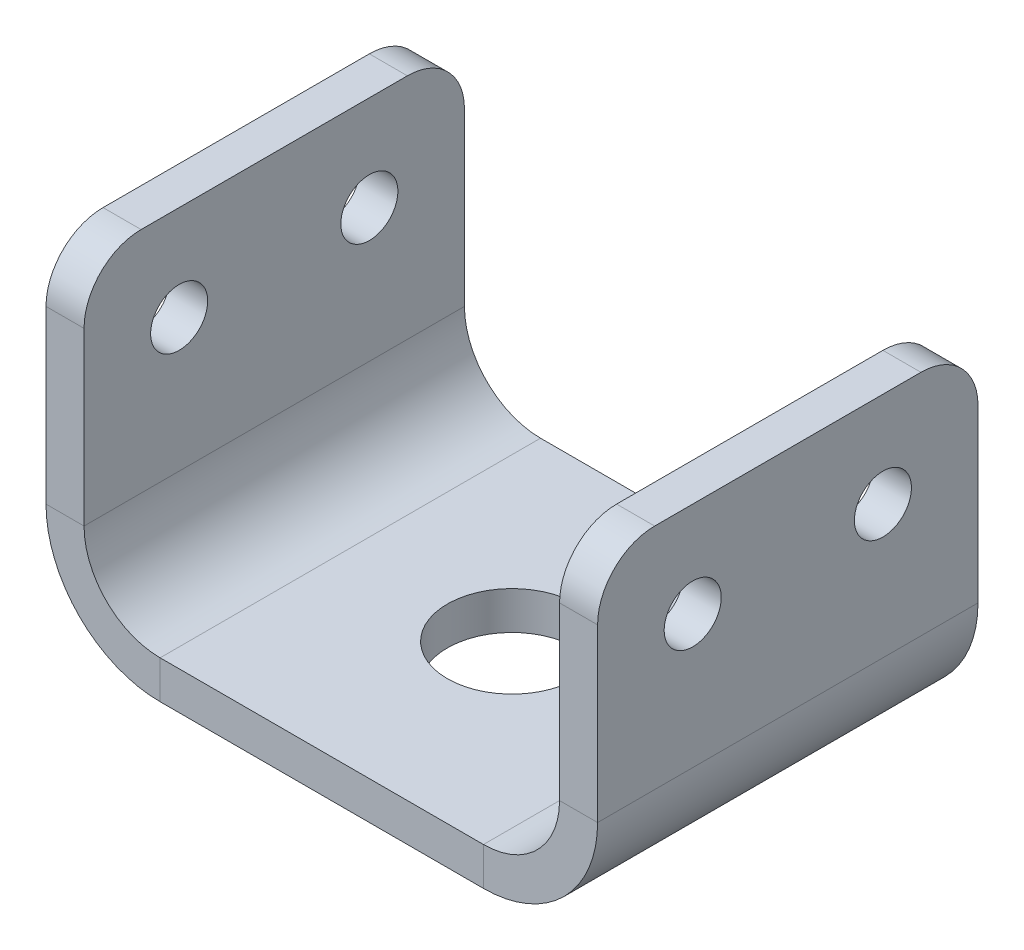
ISO-10303-21;
HEADER;
FILE_DESCRIPTION(('STEP AP214'),'2;1');
FILE_NAME('part.step','',(''),(''),'','','');
FILE_SCHEMA(('AUTOMOTIVE_DESIGN { 1 0 10303 214 1 1 1 1 }'));
ENDSEC;
DATA;
#1=APPLICATION_CONTEXT('core data for automotive mechanical design processes');
#2=APPLICATION_PROTOCOL_DEFINITION('international standard','automotive_design',2000,#1);
#3=PRODUCT_CONTEXT('',#1,'mechanical');
#4=PRODUCT('Part','Part','',(#3));
#5=PRODUCT_RELATED_PRODUCT_CATEGORY('part','',(#4));
#6=PRODUCT_DEFINITION_FORMATION('','',#4);
#7=PRODUCT_DEFINITION_CONTEXT('part definition',#1,'design');
#8=PRODUCT_DEFINITION('design','',#6,#7);
#9=PRODUCT_DEFINITION_SHAPE('','',#8);
#10=(LENGTH_UNIT() NAMED_UNIT(*) SI_UNIT(.MILLI.,.METRE.));
#11=(NAMED_UNIT(*) PLANE_ANGLE_UNIT() SI_UNIT($,.RADIAN.));
#12=(NAMED_UNIT(*) SI_UNIT($,.STERADIAN.) SOLID_ANGLE_UNIT());
#13=UNCERTAINTY_MEASURE_WITH_UNIT(LENGTH_MEASURE(1.E-05),#10,'distance_accuracy_value','');
#14=(GEOMETRIC_REPRESENTATION_CONTEXT(3) GLOBAL_UNCERTAINTY_ASSIGNED_CONTEXT((#13)) GLOBAL_UNIT_ASSIGNED_CONTEXT((#10,
#11,#12)) REPRESENTATION_CONTEXT('',''));
#15=CARTESIAN_POINT('',(0.,0.,0.));
#16=DIRECTION('',(0.,0.,1.));
#17=DIRECTION('',(1.,0.,0.));
#18=AXIS2_PLACEMENT_3D('',#15,#16,#17);
#19=CARTESIAN_POINT('',(14.5,-6.,10.));
#20=DIRECTION('',(0.,0.,-1.));
#21=DIRECTION('',(-1.,0.,0.));
#22=AXIS2_PLACEMENT_3D('',#19,#20,#21);
#23=PLANE('',#22);
#24=DIRECTION('',(0.,-1.,0.));
#25=VECTOR('',#24,1.);
#26=CARTESIAN_POINT('',(8.5,-6.,10.));
#27=LINE('',#26,#25);
#28=CARTESIAN_POINT('',(8.5,-4.,10.));
#29=VERTEX_POINT('',#28);
#30=CARTESIAN_POINT('',(8.5,-6.,10.));
#31=VERTEX_POINT('',#30);
#32=EDGE_CURVE('E11',#29,#31,#27,.T.);
#33=ORIENTED_EDGE('',*,*,#32,.F.);
#34=DIRECTION('',(1.,0.,0.));
#35=VECTOR('',#34,1.);
#36=CARTESIAN_POINT('',(14.5,-4.,10.));
#37=LINE('',#36,#35);
#38=CARTESIAN_POINT('',(-8.49999999999999,-4.,10.));
#39=VERTEX_POINT('',#38);
#40=EDGE_CURVE('E119',#29,#39,#37,.F.);
#41=ORIENTED_EDGE('',*,*,#40,.T.);
#42=DIRECTION('',(0.,-1.,0.));
#43=VECTOR('',#42,1.);
#44=CARTESIAN_POINT('',(-8.49999999999999,-6.,10.));
#45=LINE('',#44,#43);
#46=CARTESIAN_POINT('',(-8.49999999999999,-6.,10.));
#47=VERTEX_POINT('',#46);
#48=EDGE_CURVE('E55',#39,#47,#45,.T.);
#49=ORIENTED_EDGE('',*,*,#48,.T.);
#50=DIRECTION('',(-1.,0.,0.));
#51=VECTOR('',#50,1.);
#52=CARTESIAN_POINT('',(14.5,-6.,10.));
#53=LINE('',#52,#51);
#54=EDGE_CURVE('E122',#31,#47,#53,.T.);
#55=ORIENTED_EDGE('',*,*,#54,.F.);
#56=EDGE_LOOP('',(#33,#41,#49,#55));
#57=FACE_BOUND('',#56,.T.);
#58=ADVANCED_FACE('F45',(#57),#23,.F.);
#59=CARTESIAN_POINT('',(-8.5,0.,10.));
#60=DIRECTION('',(0.,0.,1.));
#61=DIRECTION('',(1.,0.,0.));
#62=AXIS2_PLACEMENT_3D('',#59,#60,#61);
#63=PLANE('',#62);
#64=ORIENTED_EDGE('',*,*,#48,.F.);
#65=CARTESIAN_POINT('',(-8.5,0.,10.));
#66=DIRECTION('',(0.,0.,1.));
#67=DIRECTION('',(0.,-1.,0.));
#68=AXIS2_PLACEMENT_3D('',#65,#66,#67);
#69=CIRCLE('',#68,4.);
#70=CARTESIAN_POINT('',(-12.5,0.,10.));
#71=VERTEX_POINT('',#70);
#72=EDGE_CURVE('E160',#39,#71,#69,.F.);
#73=ORIENTED_EDGE('',*,*,#72,.T.);
#74=DIRECTION('',(-1.,0.,0.));
#75=VECTOR('',#74,1.);
#76=CARTESIAN_POINT('',(-14.5,0.,10.));
#77=LINE('',#76,#75);
#78=CARTESIAN_POINT('',(-14.5,0.,10.));
#79=VERTEX_POINT('',#78);
#80=EDGE_CURVE('E63',#71,#79,#77,.T.);
#81=ORIENTED_EDGE('',*,*,#80,.T.);
#82=CARTESIAN_POINT('',(-8.5,0.,10.));
#83=DIRECTION('',(0.,0.,-1.));
#84=DIRECTION('',(-1.,0.,0.));
#85=AXIS2_PLACEMENT_3D('',#82,#83,#84);
#86=CIRCLE('',#85,6.);
#87=EDGE_CURVE('E218',#47,#79,#86,.T.);
#88=ORIENTED_EDGE('',*,*,#87,.F.);
#89=EDGE_LOOP('',(#64,#73,#81,#88));
#90=FACE_BOUND('',#89,.T.);
#91=ADVANCED_FACE('F219',(#90),#63,.T.);
#92=CARTESIAN_POINT('',(-14.5,0.,10.));
#93=DIRECTION('',(0.,0.,-1.));
#94=DIRECTION('',(0.,-1.,0.));
#95=AXIS2_PLACEMENT_3D('',#92,#93,#94);
#96=PLANE('',#95);
#97=ORIENTED_EDGE('',*,*,#80,.F.);
#98=DIRECTION('',(0.,1.,0.));
#99=VECTOR('',#98,1.);
#100=CARTESIAN_POINT('',(-12.5,0.,10.));
#101=LINE('',#100,#99);
#102=CARTESIAN_POINT('',(-12.5,9.,10.));
#103=VERTEX_POINT('',#102);
#104=EDGE_CURVE('E274',#103,#71,#101,.F.);
#105=ORIENTED_EDGE('',*,*,#104,.F.);
#106=DIRECTION('',(-1.,0.,0.));
#107=VECTOR('',#106,1.);
#108=CARTESIAN_POINT('',(-14.5,9.,10.));
#109=LINE('',#108,#107);
#110=CARTESIAN_POINT('',(-14.5,9.,10.));
#111=VERTEX_POINT('',#110);
#112=EDGE_CURVE('E202',#103,#111,#109,.T.);
#113=ORIENTED_EDGE('',*,*,#112,.T.);
#114=DIRECTION('',(0.,-1.,0.));
#115=VECTOR('',#114,1.);
#116=CARTESIAN_POINT('',(-14.5,0.,10.));
#117=LINE('',#116,#115);
#118=EDGE_CURVE('E296',#111,#79,#117,.T.);
#119=ORIENTED_EDGE('',*,*,#118,.T.);
#120=EDGE_LOOP('',(#97,#105,#113,#119));
#121=FACE_BOUND('',#120,.T.);
#122=ADVANCED_FACE('F293',(#121),#96,.F.);
#123=CARTESIAN_POINT('',(-14.5,9.,7.));
#124=DIRECTION('',(-1.,0.,0.));
#125=DIRECTION('',(0.,0.,1.));
#126=AXIS2_PLACEMENT_3D('',#123,#124,#125);
#127=CYLINDRICAL_SURFACE('',#126,3.);
#128=ORIENTED_EDGE('',*,*,#112,.F.);
#129=CARTESIAN_POINT('',(-12.5,9.,7.));
#130=DIRECTION('',(-1.,0.,0.));
#131=DIRECTION('',(0.,0.,1.));
#132=AXIS2_PLACEMENT_3D('',#129,#130,#131);
#133=CIRCLE('',#132,3.);
#134=CARTESIAN_POINT('',(-12.5,12.,7.));
#135=VERTEX_POINT('',#134);
#136=EDGE_CURVE('E251',#103,#135,#133,.T.);
#137=ORIENTED_EDGE('',*,*,#136,.T.);
#138=DIRECTION('',(-1.,0.,0.));
#139=VECTOR('',#138,1.);
#140=CARTESIAN_POINT('',(-14.5,12.,7.));
#141=LINE('',#140,#139);
#142=CARTESIAN_POINT('',(-14.5,12.,7.));
#143=VERTEX_POINT('',#142);
#144=EDGE_CURVE('E199',#135,#143,#141,.T.);
#145=ORIENTED_EDGE('',*,*,#144,.T.);
#146=CARTESIAN_POINT('',(-14.5,9.,7.));
#147=DIRECTION('',(-1.,0.,0.));
#148=DIRECTION('',(0.,0.,1.));
#149=AXIS2_PLACEMENT_3D('',#146,#147,#148);
#150=CIRCLE('',#149,3.);
#151=EDGE_CURVE('E300',#111,#143,#150,.T.);
#152=ORIENTED_EDGE('',*,*,#151,.F.);
#153=EDGE_LOOP('',(#128,#137,#145,#152));
#154=FACE_BOUND('',#153,.T.);
#155=ADVANCED_FACE('F397',(#154),#127,.T.);
#156=CARTESIAN_POINT('',(-14.5,12.,-10.));
#157=DIRECTION('',(0.,-1.,0.));
#158=DIRECTION('',(0.,0.,1.));
#159=AXIS2_PLACEMENT_3D('',#156,#157,#158);
#160=PLANE('',#159);
#161=ORIENTED_EDGE('',*,*,#144,.F.);
#162=DIRECTION('',(0.,0.,1.));
#163=VECTOR('',#162,1.);
#164=CARTESIAN_POINT('',(-12.5,12.,0.));
#165=LINE('',#164,#163);
#166=CARTESIAN_POINT('',(-12.5,12.,-7.));
#167=VERTEX_POINT('',#166);
#168=EDGE_CURVE('E169',#167,#135,#165,.T.);
#169=ORIENTED_EDGE('',*,*,#168,.F.);
#170=DIRECTION('',(-1.,0.,0.));
#171=VECTOR('',#170,1.);
#172=CARTESIAN_POINT('',(-14.5,12.,-7.));
#173=LINE('',#172,#171);
#174=CARTESIAN_POINT('',(-14.5,12.,-7.));
#175=VERTEX_POINT('',#174);
#176=EDGE_CURVE('E196',#167,#175,#173,.T.);
#177=ORIENTED_EDGE('',*,*,#176,.T.);
#178=DIRECTION('',(0.,0.,1.));
#179=VECTOR('',#178,1.);
#180=CARTESIAN_POINT('',(-14.5,12.,-10.));
#181=LINE('',#180,#179);
#182=EDGE_CURVE('E330',#175,#143,#181,.T.);
#183=ORIENTED_EDGE('',*,*,#182,.T.);
#184=EDGE_LOOP('',(#161,#169,#177,#183));
#185=FACE_BOUND('',#184,.T.);
#186=ADVANCED_FACE('F391',(#185),#160,.F.);
#187=CARTESIAN_POINT('',(-14.5,9.,-7.));
#188=DIRECTION('',(-1.,0.,0.));
#189=DIRECTION('',(0.,0.,1.));
#190=AXIS2_PLACEMENT_3D('',#187,#188,#189);
#191=CYLINDRICAL_SURFACE('',#190,3.);
#192=ORIENTED_EDGE('',*,*,#176,.F.);
#193=CARTESIAN_POINT('',(-12.5,9.,-7.));
#194=DIRECTION('',(-1.,0.,0.));
#195=DIRECTION('',(0.,0.,1.));
#196=AXIS2_PLACEMENT_3D('',#193,#194,#195);
#197=CIRCLE('',#196,3.);
#198=CARTESIAN_POINT('',(-12.5,9.,-9.99999999999999));
#199=VERTEX_POINT('',#198);
#200=EDGE_CURVE('E275',#167,#199,#197,.T.);
#201=ORIENTED_EDGE('',*,*,#200,.T.);
#202=DIRECTION('',(-1.,0.,0.));
#203=VECTOR('',#202,1.);
#204=CARTESIAN_POINT('',(-14.5,9.,-9.99999999999999));
#205=LINE('',#204,#203);
#206=CARTESIAN_POINT('',(-14.5,9.,-9.99999999999999));
#207=VERTEX_POINT('',#206);
#208=EDGE_CURVE('E193',#199,#207,#205,.T.);
#209=ORIENTED_EDGE('',*,*,#208,.T.);
#210=CARTESIAN_POINT('',(-14.5,9.,-7.));
#211=DIRECTION('',(-1.,0.,0.));
#212=DIRECTION('',(0.,0.,1.));
#213=AXIS2_PLACEMENT_3D('',#210,#211,#212);
#214=CIRCLE('',#213,3.);
#215=EDGE_CURVE('E310',#175,#207,#214,.T.);
#216=ORIENTED_EDGE('',*,*,#215,.F.);
#217=EDGE_LOOP('',(#192,#201,#209,#216));
#218=FACE_BOUND('',#217,.T.);
#219=ADVANCED_FACE('F394',(#218),#191,.T.);
#220=CARTESIAN_POINT('',(-14.5,0.,-10.));
#221=DIRECTION('',(0.,0.,1.));
#222=DIRECTION('',(0.,1.,0.));
#223=AXIS2_PLACEMENT_3D('',#220,#221,#222);
#224=PLANE('',#223);
#225=ORIENTED_EDGE('',*,*,#208,.F.);
#226=DIRECTION('',(0.,1.,0.));
#227=VECTOR('',#226,1.);
#228=CARTESIAN_POINT('',(-12.5,0.,-10.));
#229=LINE('',#228,#227);
#230=CARTESIAN_POINT('',(-12.5,0.,-10.));
#231=VERTEX_POINT('',#230);
#232=EDGE_CURVE('E271',#231,#199,#229,.T.);
#233=ORIENTED_EDGE('',*,*,#232,.F.);
#234=DIRECTION('',(-1.,0.,0.));
#235=VECTOR('',#234,1.);
#236=CARTESIAN_POINT('',(-14.5,0.,-10.));
#237=LINE('',#236,#235);
#238=CARTESIAN_POINT('',(-14.5,0.,-10.));
#239=VERTEX_POINT('',#238);
#240=EDGE_CURVE('E191',#231,#239,#237,.T.);
#241=ORIENTED_EDGE('',*,*,#240,.T.);
#242=DIRECTION('',(0.,1.,0.));
#243=VECTOR('',#242,1.);
#244=CARTESIAN_POINT('',(-14.5,0.,-10.));
#245=LINE('',#244,#243);
#246=EDGE_CURVE('E301',#239,#207,#245,.T.);
#247=ORIENTED_EDGE('',*,*,#246,.T.);
#248=EDGE_LOOP('',(#225,#233,#241,#247));
#249=FACE_BOUND('',#248,.T.);
#250=ADVANCED_FACE('F395',(#249),#224,.F.);
#251=CARTESIAN_POINT('',(-8.5,0.,-10.));
#252=DIRECTION('',(0.,0.,1.));
#253=DIRECTION('',(0.,-1.,0.));
#254=AXIS2_PLACEMENT_3D('',#251,#252,#253);
#255=PLANE('',#254);
#256=ORIENTED_EDGE('',*,*,#240,.F.);
#257=CARTESIAN_POINT('',(-8.5,0.,-10.));
#258=DIRECTION('',(0.,0.,1.));
#259=DIRECTION('',(0.,-1.,0.));
#260=AXIS2_PLACEMENT_3D('',#257,#258,#259);
#261=CIRCLE('',#260,4.);
#262=CARTESIAN_POINT('',(-8.49999999999999,-4.,-10.));
#263=VERTEX_POINT('',#262);
#264=EDGE_CURVE('E268',#231,#263,#261,.T.);
#265=ORIENTED_EDGE('',*,*,#264,.T.);
#266=DIRECTION('',(0.,-1.,0.));
#267=VECTOR('',#266,1.);
#268=CARTESIAN_POINT('',(-8.49999999999999,-6.,-10.));
#269=LINE('',#268,#267);
#270=CARTESIAN_POINT('',(-8.49999999999999,-6.,-10.));
#271=VERTEX_POINT('',#270);
#272=EDGE_CURVE('E188',#263,#271,#269,.T.);
#273=ORIENTED_EDGE('',*,*,#272,.T.);
#274=CARTESIAN_POINT('',(-8.5,0.,-10.));
#275=DIRECTION('',(0.,0.,-1.));
#276=DIRECTION('',(0.,1.,0.));
#277=AXIS2_PLACEMENT_3D('',#274,#275,#276);
#278=CIRCLE('',#277,6.);
#279=EDGE_CURVE('E224',#239,#271,#278,.F.);
#280=ORIENTED_EDGE('',*,*,#279,.F.);
#281=EDGE_LOOP('',(#256,#265,#273,#280));
#282=FACE_BOUND('',#281,.T.);
#283=ADVANCED_FACE('F314',(#282),#255,.F.);
#284=CARTESIAN_POINT('',(14.5,-6.,-10.));
#285=DIRECTION('',(0.,0.,-1.));
#286=DIRECTION('',(-1.,0.,0.));
#287=AXIS2_PLACEMENT_3D('',#284,#285,#286);
#288=PLANE('',#287);
#289=ORIENTED_EDGE('',*,*,#272,.F.);
#290=DIRECTION('',(1.,0.,0.));
#291=VECTOR('',#290,1.);
#292=CARTESIAN_POINT('',(14.5,-4.,-10.));
#293=LINE('',#292,#291);
#294=CARTESIAN_POINT('',(8.5,-4.,-10.));
#295=VERTEX_POINT('',#294);
#296=EDGE_CURVE('E150',#295,#263,#293,.F.);
#297=ORIENTED_EDGE('',*,*,#296,.F.);
#298=DIRECTION('',(0.,-1.,0.));
#299=VECTOR('',#298,1.);
#300=CARTESIAN_POINT('',(8.5,-6.,-10.));
#301=LINE('',#300,#299);
#302=CARTESIAN_POINT('',(8.5,-6.,-10.));
#303=VERTEX_POINT('',#302);
#304=EDGE_CURVE('E185',#295,#303,#301,.T.);
#305=ORIENTED_EDGE('',*,*,#304,.T.);
#306=DIRECTION('',(-1.,0.,0.));
#307=VECTOR('',#306,1.);
#308=CARTESIAN_POINT('',(14.5,-6.,-10.));
#309=LINE('',#308,#307);
#310=EDGE_CURVE('E216',#303,#271,#309,.T.);
#311=ORIENTED_EDGE('',*,*,#310,.T.);
#312=EDGE_LOOP('',(#289,#297,#305,#311));
#313=FACE_BOUND('',#312,.T.);
#314=ADVANCED_FACE('F317',(#313),#288,.T.);
#315=CARTESIAN_POINT('',(8.5,0.,-10.));
#316=DIRECTION('',(0.,0.,-1.));
#317=DIRECTION('',(0.,1.,0.));
#318=AXIS2_PLACEMENT_3D('',#315,#316,#317);
#319=PLANE('',#318);
#320=ORIENTED_EDGE('',*,*,#304,.F.);
#321=CARTESIAN_POINT('',(8.5,0.,-10.));
#322=DIRECTION('',(0.,0.,-1.));
#323=DIRECTION('',(0.,1.,0.));
#324=AXIS2_PLACEMENT_3D('',#321,#322,#323);
#325=CIRCLE('',#324,4.);
#326=CARTESIAN_POINT('',(12.5,0.,-10.));
#327=VERTEX_POINT('',#326);
#328=EDGE_CURVE('E138',#295,#327,#325,.F.);
#329=ORIENTED_EDGE('',*,*,#328,.T.);
#330=DIRECTION('',(1.,0.,0.));
#331=VECTOR('',#330,1.);
#332=CARTESIAN_POINT('',(14.5,0.,-10.));
#333=LINE('',#332,#331);
#334=CARTESIAN_POINT('',(14.5,0.,-10.));
#335=VERTEX_POINT('',#334);
#336=EDGE_CURVE('E182',#327,#335,#333,.T.);
#337=ORIENTED_EDGE('',*,*,#336,.T.);
#338=CARTESIAN_POINT('',(8.5,0.,-10.));
#339=DIRECTION('',(0.,0.,1.));
#340=DIRECTION('',(0.,-1.,0.));
#341=AXIS2_PLACEMENT_3D('',#338,#339,#340);
#342=CIRCLE('',#341,6.);
#343=EDGE_CURVE('E223',#303,#335,#342,.T.);
#344=ORIENTED_EDGE('',*,*,#343,.F.);
#345=EDGE_LOOP('',(#320,#329,#337,#344));
#346=FACE_BOUND('',#345,.T.);
#347=ADVANCED_FACE('F473',(#346),#319,.T.);
#348=CARTESIAN_POINT('',(14.5,0.,-10.));
#349=DIRECTION('',(0.,0.,1.));
#350=DIRECTION('',(0.,1.,0.));
#351=AXIS2_PLACEMENT_3D('',#348,#349,#350);
#352=PLANE('',#351);
#353=ORIENTED_EDGE('',*,*,#336,.F.);
#354=DIRECTION('',(0.,1.,0.));
#355=VECTOR('',#354,1.);
#356=CARTESIAN_POINT('',(12.5,0.,-10.));
#357=LINE('',#356,#355);
#358=CARTESIAN_POINT('',(12.5,9.,-9.99999999999999));
#359=VERTEX_POINT('',#358);
#360=EDGE_CURVE('E254',#327,#359,#357,.T.);
#361=ORIENTED_EDGE('',*,*,#360,.T.);
#362=DIRECTION('',(1.,0.,0.));
#363=VECTOR('',#362,1.);
#364=CARTESIAN_POINT('',(14.5,9.,-9.99999999999999));
#365=LINE('',#364,#363);
#366=CARTESIAN_POINT('',(14.5,9.,-9.99999999999999));
#367=VERTEX_POINT('',#366);
#368=EDGE_CURVE('E179',#359,#367,#365,.T.);
#369=ORIENTED_EDGE('',*,*,#368,.T.);
#370=DIRECTION('',(0.,1.,0.));
#371=VECTOR('',#370,1.);
#372=CARTESIAN_POINT('',(14.5,0.,-10.));
#373=LINE('',#372,#371);
#374=EDGE_CURVE('E341',#335,#367,#373,.T.);
#375=ORIENTED_EDGE('',*,*,#374,.F.);
#376=EDGE_LOOP('',(#353,#361,#369,#375));
#377=FACE_BOUND('',#376,.T.);
#378=ADVANCED_FACE('F469',(#377),#352,.F.);
#379=CARTESIAN_POINT('',(14.5,9.,-7.));
#380=DIRECTION('',(-1.,0.,0.));
#381=DIRECTION('',(0.,0.,1.));
#382=AXIS2_PLACEMENT_3D('',#379,#380,#381);
#383=CYLINDRICAL_SURFACE('',#382,3.);
#384=ORIENTED_EDGE('',*,*,#368,.F.);
#385=CARTESIAN_POINT('',(12.5,9.,-7.));
#386=DIRECTION('',(-1.,0.,0.));
#387=DIRECTION('',(0.,0.,1.));
#388=AXIS2_PLACEMENT_3D('',#385,#386,#387);
#389=CIRCLE('',#388,3.);
#390=CARTESIAN_POINT('',(12.5,12.,-7.));
#391=VERTEX_POINT('',#390);
#392=EDGE_CURVE('E262',#359,#391,#389,.F.);
#393=ORIENTED_EDGE('',*,*,#392,.T.);
#394=DIRECTION('',(1.,0.,0.));
#395=VECTOR('',#394,1.);
#396=CARTESIAN_POINT('',(14.5,12.,-7.));
#397=LINE('',#396,#395);
#398=CARTESIAN_POINT('',(14.5,12.,-7.));
#399=VERTEX_POINT('',#398);
#400=EDGE_CURVE('E176',#391,#399,#397,.T.);
#401=ORIENTED_EDGE('',*,*,#400,.T.);
#402=CARTESIAN_POINT('',(14.5,9.,-7.));
#403=DIRECTION('',(-1.,0.,0.));
#404=DIRECTION('',(0.,0.,1.));
#405=AXIS2_PLACEMENT_3D('',#402,#403,#404);
#406=CIRCLE('',#405,3.);
#407=EDGE_CURVE('E344',#367,#399,#406,.F.);
#408=ORIENTED_EDGE('',*,*,#407,.F.);
#409=EDGE_LOOP('',(#384,#393,#401,#408));
#410=FACE_BOUND('',#409,.T.);
#411=ADVANCED_FACE('F465',(#410),#383,.T.);
#412=CARTESIAN_POINT('',(14.5,12.,-10.));
#413=DIRECTION('',(0.,1.,0.));
#414=DIRECTION('',(0.,0.,-1.));
#415=AXIS2_PLACEMENT_3D('',#412,#413,#414);
#416=PLANE('',#415);
#417=ORIENTED_EDGE('',*,*,#400,.F.);
#418=DIRECTION('',(0.,0.,1.));
#419=VECTOR('',#418,1.);
#420=CARTESIAN_POINT('',(12.5,12.,0.));
#421=LINE('',#420,#419);
#422=CARTESIAN_POINT('',(12.5,12.,7.));
#423=VERTEX_POINT('',#422);
#424=EDGE_CURVE('E259',#423,#391,#421,.F.);
#425=ORIENTED_EDGE('',*,*,#424,.F.);
#426=DIRECTION('',(1.,0.,0.));
#427=VECTOR('',#426,1.);
#428=CARTESIAN_POINT('',(14.5,12.,7.));
#429=LINE('',#428,#427);
#430=CARTESIAN_POINT('',(14.5,12.,7.));
#431=VERTEX_POINT('',#430);
#432=EDGE_CURVE('E173',#423,#431,#429,.T.);
#433=ORIENTED_EDGE('',*,*,#432,.T.);
#434=DIRECTION('',(0.,0.,-1.));
#435=VECTOR('',#434,1.);
#436=CARTESIAN_POINT('',(14.5,12.,-10.));
#437=LINE('',#436,#435);
#438=EDGE_CURVE('E347',#431,#399,#437,.T.);
#439=ORIENTED_EDGE('',*,*,#438,.T.);
#440=EDGE_LOOP('',(#417,#425,#433,#439));
#441=FACE_BOUND('',#440,.T.);
#442=ADVANCED_FACE('F462',(#441),#416,.T.);
#443=CARTESIAN_POINT('',(14.5,9.,7.));
#444=DIRECTION('',(-1.,0.,0.));
#445=DIRECTION('',(0.,0.,1.));
#446=AXIS2_PLACEMENT_3D('',#443,#444,#445);
#447=CYLINDRICAL_SURFACE('',#446,3.);
#448=ORIENTED_EDGE('',*,*,#432,.F.);
#449=CARTESIAN_POINT('',(12.5,9.,7.));
#450=DIRECTION('',(-1.,0.,0.));
#451=DIRECTION('',(0.,0.,1.));
#452=AXIS2_PLACEMENT_3D('',#449,#450,#451);
#453=CIRCLE('',#452,3.);
#454=CARTESIAN_POINT('',(12.5,9.,10.));
#455=VERTEX_POINT('',#454);
#456=EDGE_CURVE('E256',#423,#455,#453,.F.);
#457=ORIENTED_EDGE('',*,*,#456,.T.);
#458=DIRECTION('',(1.,0.,0.));
#459=VECTOR('',#458,1.);
#460=CARTESIAN_POINT('',(14.5,9.,10.));
#461=LINE('',#460,#459);
#462=CARTESIAN_POINT('',(14.5,9.,10.));
#463=VERTEX_POINT('',#462);
#464=EDGE_CURVE('E170',#455,#463,#461,.T.);
#465=ORIENTED_EDGE('',*,*,#464,.T.);
#466=CARTESIAN_POINT('',(14.5,9.,7.));
#467=DIRECTION('',(-1.,0.,0.));
#468=DIRECTION('',(0.,0.,1.));
#469=AXIS2_PLACEMENT_3D('',#466,#467,#468);
#470=CIRCLE('',#469,3.);
#471=EDGE_CURVE('E350',#431,#463,#470,.F.);
#472=ORIENTED_EDGE('',*,*,#471,.F.);
#473=EDGE_LOOP('',(#448,#457,#465,#472));
#474=FACE_BOUND('',#473,.T.);
#475=ADVANCED_FACE('F459',(#474),#447,.T.);
#476=CARTESIAN_POINT('',(14.5,0.,10.));
#477=DIRECTION('',(0.,0.,-1.));
#478=DIRECTION('',(0.,-1.,0.));
#479=AXIS2_PLACEMENT_3D('',#476,#477,#478);
#480=PLANE('',#479);
#481=ORIENTED_EDGE('',*,*,#464,.F.);
#482=DIRECTION('',(0.,1.,0.));
#483=VECTOR('',#482,1.);
#484=CARTESIAN_POINT('',(12.5,0.,10.));
#485=LINE('',#484,#483);
#486=CARTESIAN_POINT('',(12.5,0.,10.));
#487=VERTEX_POINT('',#486);
#488=EDGE_CURVE('E242',#455,#487,#485,.F.);
#489=ORIENTED_EDGE('',*,*,#488,.T.);
#490=DIRECTION('',(1.,0.,0.));
#491=VECTOR('',#490,1.);
#492=CARTESIAN_POINT('',(14.5,0.,10.));
#493=LINE('',#492,#491);
#494=CARTESIAN_POINT('',(14.5,0.,10.));
#495=VERTEX_POINT('',#494);
#496=EDGE_CURVE('E49',#487,#495,#493,.T.);
#497=ORIENTED_EDGE('',*,*,#496,.T.);
#498=DIRECTION('',(0.,-1.,0.));
#499=VECTOR('',#498,1.);
#500=CARTESIAN_POINT('',(14.5,0.,10.));
#501=LINE('',#500,#499);
#502=EDGE_CURVE('E353',#463,#495,#501,.T.);
#503=ORIENTED_EDGE('',*,*,#502,.F.);
#504=EDGE_LOOP('',(#481,#489,#497,#503));
#505=FACE_BOUND('',#504,.T.);
#506=ADVANCED_FACE('F373',(#505),#480,.F.);
#507=CARTESIAN_POINT('',(0.,-6.,0.));
#508=DIRECTION('',(0.,1.,0.));
#509=DIRECTION('',(0.,0.,1.));
#510=AXIS2_PLACEMENT_3D('',#507,#508,#509);
#511=CYLINDRICAL_SURFACE('',#510,3.4);
#512=CARTESIAN_POINT('',(0.,-6.,0.));
#513=DIRECTION('',(0.,-1.,0.));
#514=DIRECTION('',(0.,0.,-1.));
#515=AXIS2_PLACEMENT_3D('',#512,#513,#514);
#516=CIRCLE('',#515,3.4);
#517=CARTESIAN_POINT('',(0.,-6.,3.4));
#518=VERTEX_POINT('',#517);
#519=EDGE_CURVE('E320',#518,#518,#516,.T.);
#520=CARTESIAN_POINT('',(0.,-4.,0.));
#521=DIRECTION('',(0.,-1.,0.));
#522=DIRECTION('',(0.,0.,-1.));
#523=AXIS2_PLACEMENT_3D('',#520,#521,#522);
#524=CIRCLE('',#523,3.4);
#525=CARTESIAN_POINT('',(0.,-4.,3.4));
#526=VERTEX_POINT('',#525);
#527=EDGE_CURVE('E156',#526,#526,#524,.T.);
#528=CARTESIAN_POINT('',(0.,-6.,3.4));
#529=CARTESIAN_POINT('',(0.,-5.97916666666667,3.4));
#530=CARTESIAN_POINT('',(0.,-5.95833333333333,3.4));
#531=CARTESIAN_POINT('',(0.,-5.91666666666667,3.4));
#532=CARTESIAN_POINT('',(0.,-5.89583333333333,3.4));
#533=CARTESIAN_POINT('',(0.,-5.85416666666667,3.4));
#534=CARTESIAN_POINT('',(0.,-5.83333333333333,3.4));
#535=CARTESIAN_POINT('',(0.,-5.79166666666667,3.4));
#536=CARTESIAN_POINT('',(0.,-5.77083333333333,3.4));
#537=CARTESIAN_POINT('',(0.,-5.72916666666667,3.4));
#538=CARTESIAN_POINT('',(0.,-5.70833333333333,3.4));
#539=CARTESIAN_POINT('',(0.,-5.66666666666667,3.4));
#540=CARTESIAN_POINT('',(0.,-5.64583333333333,3.4));
#541=CARTESIAN_POINT('',(0.,-5.60416666666667,3.4));
#542=CARTESIAN_POINT('',(0.,-5.58333333333333,3.4));
#543=CARTESIAN_POINT('',(0.,-5.54166666666667,3.4));
#544=CARTESIAN_POINT('',(0.,-5.52083333333333,3.4));
#545=CARTESIAN_POINT('',(0.,-5.47916666666667,3.4));
#546=CARTESIAN_POINT('',(0.,-5.45833333333333,3.4));
#547=CARTESIAN_POINT('',(0.,-5.41666666666667,3.4));
#548=CARTESIAN_POINT('',(0.,-5.39583333333333,3.4));
#549=CARTESIAN_POINT('',(0.,-5.35416666666667,3.4));
#550=CARTESIAN_POINT('',(0.,-5.33333333333333,3.4));
#551=CARTESIAN_POINT('',(0.,-5.29166666666667,3.4));
#552=CARTESIAN_POINT('',(0.,-5.27083333333333,3.4));
#553=CARTESIAN_POINT('',(0.,-5.22916666666667,3.4));
#554=CARTESIAN_POINT('',(0.,-5.20833333333333,3.4));
#555=CARTESIAN_POINT('',(0.,-5.16666666666667,3.4));
#556=CARTESIAN_POINT('',(0.,-5.14583333333333,3.4));
#557=CARTESIAN_POINT('',(0.,-5.10416666666667,3.4));
#558=CARTESIAN_POINT('',(0.,-5.08333333333333,3.4));
#559=CARTESIAN_POINT('',(0.,-5.04166666666667,3.4));
#560=CARTESIAN_POINT('',(0.,-5.02083333333333,3.4));
#561=CARTESIAN_POINT('',(0.,-4.97916666666667,3.4));
#562=CARTESIAN_POINT('',(0.,-4.95833333333333,3.4));
#563=CARTESIAN_POINT('',(0.,-4.91666666666667,3.4));
#564=CARTESIAN_POINT('',(0.,-4.89583333333333,3.4));
#565=CARTESIAN_POINT('',(0.,-4.85416666666667,3.4));
#566=CARTESIAN_POINT('',(0.,-4.83333333333333,3.4));
#567=CARTESIAN_POINT('',(0.,-4.79166666666667,3.4));
#568=CARTESIAN_POINT('',(0.,-4.77083333333333,3.4));
#569=CARTESIAN_POINT('',(0.,-4.72916666666667,3.4));
#570=CARTESIAN_POINT('',(0.,-4.70833333333333,3.4));
#571=CARTESIAN_POINT('',(0.,-4.66666666666667,3.4));
#572=CARTESIAN_POINT('',(0.,-4.64583333333333,3.4));
#573=CARTESIAN_POINT('',(0.,-4.60416666666667,3.4));
#574=CARTESIAN_POINT('',(0.,-4.58333333333333,3.4));
#575=CARTESIAN_POINT('',(0.,-4.54166666666667,3.4));
#576=CARTESIAN_POINT('',(0.,-4.52083333333333,3.4));
#577=CARTESIAN_POINT('',(0.,-4.47916666666667,3.4));
#578=CARTESIAN_POINT('',(0.,-4.45833333333333,3.4));
#579=CARTESIAN_POINT('',(0.,-4.41666666666667,3.4));
#580=CARTESIAN_POINT('',(0.,-4.39583333333333,3.4));
#581=CARTESIAN_POINT('',(0.,-4.35416666666667,3.4));
#582=CARTESIAN_POINT('',(0.,-4.33333333333333,3.4));
#583=CARTESIAN_POINT('',(0.,-4.29166666666667,3.4));
#584=CARTESIAN_POINT('',(0.,-4.27083333333333,3.4));
#585=CARTESIAN_POINT('',(0.,-4.22916666666667,3.4));
#586=CARTESIAN_POINT('',(0.,-4.20833333333333,3.4));
#587=CARTESIAN_POINT('',(0.,-4.16666666666667,3.4));
#588=CARTESIAN_POINT('',(0.,-4.14583333333333,3.4));
#589=CARTESIAN_POINT('',(0.,-4.10416666666667,3.4));
#590=CARTESIAN_POINT('',(0.,-4.08333333333333,3.4));
#591=CARTESIAN_POINT('',(0.,-4.04166666666667,3.4));
#592=CARTESIAN_POINT('',(0.,-4.02083333333333,3.4));
#593=CARTESIAN_POINT('',(0.,-4.,3.4));
#594=B_SPLINE_CURVE_WITH_KNOTS('',3,(#528,#529,#530,#531,#532,#533,#534,#535,#536,#537,#538,
#539,#540,#541,#542,#543,#544,#545,#546,#547,#548,#549,#550,#551,#552,#553,#554,#555,#556,#557,
#558,#559,#560,#561,#562,#563,#564,#565,#566,#567,#568,#569,#570,#571,#572,#573,#574,#575,#576,
#577,#578,#579,#580,#581,#582,#583,#584,#585,#586,#587,#588,#589,#590,#591,#592,#593),
.UNSPECIFIED.,.F.,.F.,(4,2,2,2,2,2,2,2,2,2,2,2,2,2,2,2,2,2,2,2,2,2,2,2,2,2,2,2,2,2,2,2,4),(0.,
0.0624999999999992,0.124999999999999,0.187499999999999,0.249999999999999,0.312499999999999,
0.374999999999999,0.4375,0.5,0.562499999999999,0.624999999999999,0.687499999999999,
0.749999999999999,0.812499999999999,0.874999999999999,0.937499999999999,0.999999999999998,
1.0625,1.125,1.1875,1.25,1.3125,1.375,1.4375,1.5,1.5625,1.625,1.6875,1.75,1.8125,1.875,1.9375,
2.),.UNSPECIFIED.);
#595=EDGE_CURVE('BSEAM416',#518,#526,#594,.T.);
#596=ORIENTED_EDGE('',*,*,#519,.T.);
#597=ORIENTED_EDGE('',*,*,#527,.F.);
#598=ORIENTED_EDGE('',*,*,#595,.T.);
#599=ORIENTED_EDGE('',*,*,#595,.F.);
#600=EDGE_LOOP('',(#596,#598,#597,#599));
#601=FACE_BOUND('',#600,.T.);
#602=ADVANCED_FACE('F416',(#601),#511,.F.);
#603=CARTESIAN_POINT('',(-14.5,7.,-5.));
#604=DIRECTION('',(-1.,0.,0.));
#605=DIRECTION('',(0.,0.,1.));
#606=AXIS2_PLACEMENT_3D('',#603,#604,#605);
#607=CYLINDRICAL_SURFACE('',#606,1.5);
#608=CARTESIAN_POINT('',(-14.5,7.,-5.));
#609=DIRECTION('',(-1.,0.,0.));
#610=DIRECTION('',(0.,0.,1.));
#611=AXIS2_PLACEMENT_3D('',#608,#609,#610);
#612=CIRCLE('',#611,1.5);
#613=CARTESIAN_POINT('',(-14.5,7.,-3.5));
#614=VERTEX_POINT('',#613);
#615=EDGE_CURVE('E215',#614,#614,#612,.T.);
#616=ORIENTED_EDGE('',*,*,#615,.T.);
#617=EDGE_LOOP('',(#616));
#618=FACE_BOUND('',#617,.T.);
#619=CARTESIAN_POINT('',(-12.5,7.,-5.));
#620=DIRECTION('',(-1.,0.,0.));
#621=DIRECTION('',(0.,0.,1.));
#622=AXIS2_PLACEMENT_3D('',#619,#620,#621);
#623=CIRCLE('',#622,1.5);
#624=CARTESIAN_POINT('',(-12.5,7.,-3.5));
#625=VERTEX_POINT('',#624);
#626=EDGE_CURVE('E149',#625,#625,#623,.T.);
#627=ORIENTED_EDGE('',*,*,#626,.F.);
#628=EDGE_LOOP('',(#627));
#629=FACE_BOUND('',#628,.T.);
#630=ADVANCED_FACE('F418',(#618,#629),#607,.F.);
#631=CARTESIAN_POINT('',(-14.5,7.,5.));
#632=DIRECTION('',(-1.,0.,0.));
#633=DIRECTION('',(0.,0.,1.));
#634=AXIS2_PLACEMENT_3D('',#631,#632,#633);
#635=CYLINDRICAL_SURFACE('',#634,1.5);
#636=CARTESIAN_POINT('',(-14.5,7.,5.));
#637=DIRECTION('',(-1.,0.,0.));
#638=DIRECTION('',(0.,0.,1.));
#639=AXIS2_PLACEMENT_3D('',#636,#637,#638);
#640=CIRCLE('',#639,1.5);
#641=CARTESIAN_POINT('',(-14.5,7.,6.5));
#642=VERTEX_POINT('',#641);
#643=EDGE_CURVE('E327',#642,#642,#640,.T.);
#644=ORIENTED_EDGE('',*,*,#643,.T.);
#645=EDGE_LOOP('',(#644));
#646=FACE_BOUND('',#645,.T.);
#647=CARTESIAN_POINT('',(-12.5,7.,5.));
#648=DIRECTION('',(-1.,0.,0.));
#649=DIRECTION('',(0.,0.,1.));
#650=AXIS2_PLACEMENT_3D('',#647,#648,#649);
#651=CIRCLE('',#650,1.5);
#652=CARTESIAN_POINT('',(-12.5,7.,6.5));
#653=VERTEX_POINT('',#652);
#654=EDGE_CURVE('E166',#653,#653,#651,.T.);
#655=ORIENTED_EDGE('',*,*,#654,.F.);
#656=EDGE_LOOP('',(#655));
#657=FACE_BOUND('',#656,.T.);
#658=ADVANCED_FACE('F47',(#646,#657),#635,.F.);
#659=CARTESIAN_POINT('',(14.5,7.,-5.));
#660=DIRECTION('',(-1.,0.,0.));
#661=DIRECTION('',(0.,0.,1.));
#662=AXIS2_PLACEMENT_3D('',#659,#660,#661);
#663=CYLINDRICAL_SURFACE('',#662,1.5);
#664=CARTESIAN_POINT('',(14.5,7.,-5.));
#665=DIRECTION('',(-1.,0.,0.));
#666=DIRECTION('',(0.,0.,1.));
#667=AXIS2_PLACEMENT_3D('',#664,#665,#666);
#668=CIRCLE('',#667,1.5);
#669=CARTESIAN_POINT('',(14.5,7.,-3.5));
#670=VERTEX_POINT('',#669);
#671=EDGE_CURVE('E335',#670,#670,#668,.T.);
#672=ORIENTED_EDGE('',*,*,#671,.F.);
#673=EDGE_LOOP('',(#672));
#674=FACE_BOUND('',#673,.T.);
#675=CARTESIAN_POINT('',(12.5,7.,-5.));
#676=DIRECTION('',(-1.,0.,0.));
#677=DIRECTION('',(0.,0.,1.));
#678=AXIS2_PLACEMENT_3D('',#675,#676,#677);
#679=CIRCLE('',#678,1.5);
#680=CARTESIAN_POINT('',(12.5,7.,-3.5));
#681=VERTEX_POINT('',#680);
#682=EDGE_CURVE('E247',#681,#681,#679,.T.);
#683=ORIENTED_EDGE('',*,*,#682,.T.);
#684=EDGE_LOOP('',(#683));
#685=FACE_BOUND('',#684,.T.);
#686=ADVANCED_FACE('F425',(#674,#685),#663,.F.);
#687=CARTESIAN_POINT('',(14.5,7.,5.));
#688=DIRECTION('',(-1.,0.,0.));
#689=DIRECTION('',(0.,0.,1.));
#690=AXIS2_PLACEMENT_3D('',#687,#688,#689);
#691=CYLINDRICAL_SURFACE('',#690,1.5);
#692=CARTESIAN_POINT('',(14.5,7.,5.));
#693=DIRECTION('',(-1.,0.,0.));
#694=DIRECTION('',(0.,0.,1.));
#695=AXIS2_PLACEMENT_3D('',#692,#693,#694);
#696=CIRCLE('',#695,1.5);
#697=CARTESIAN_POINT('',(14.5,7.,6.5));
#698=VERTEX_POINT('',#697);
#699=EDGE_CURVE('E338',#698,#698,#696,.T.);
#700=ORIENTED_EDGE('',*,*,#699,.F.);
#701=EDGE_LOOP('',(#700));
#702=FACE_BOUND('',#701,.T.);
#703=CARTESIAN_POINT('',(12.5,7.,5.));
#704=DIRECTION('',(-1.,0.,0.));
#705=DIRECTION('',(0.,0.,1.));
#706=AXIS2_PLACEMENT_3D('',#703,#704,#705);
#707=CIRCLE('',#706,1.5);
#708=CARTESIAN_POINT('',(12.5,7.,6.5));
#709=VERTEX_POINT('',#708);
#710=EDGE_CURVE('E250',#709,#709,#707,.T.);
#711=ORIENTED_EDGE('',*,*,#710,.T.);
#712=EDGE_LOOP('',(#711));
#713=FACE_BOUND('',#712,.T.);
#714=ADVANCED_FACE('F415',(#702,#713),#691,.F.);
#715=CARTESIAN_POINT('',(8.5,0.,10.));
#716=DIRECTION('',(0.,0.,-1.));
#717=DIRECTION('',(-1.,0.,0.));
#718=AXIS2_PLACEMENT_3D('',#715,#716,#717);
#719=PLANE('',#718);
#720=CARTESIAN_POINT('',(8.5,0.,10.));
#721=DIRECTION('',(0.,0.,-1.));
#722=DIRECTION('',(0.,1.,0.));
#723=AXIS2_PLACEMENT_3D('',#720,#721,#722);
#724=CIRCLE('',#723,4.);
#725=EDGE_CURVE('E135',#487,#29,#724,.T.);
#726=ORIENTED_EDGE('',*,*,#725,.T.);
#727=ORIENTED_EDGE('',*,*,#32,.T.);
#728=CARTESIAN_POINT('',(8.5,0.,10.));
#729=DIRECTION('',(0.,0.,1.));
#730=DIRECTION('',(1.,0.,0.));
#731=AXIS2_PLACEMENT_3D('',#728,#729,#730);
#732=CIRCLE('',#731,6.);
#733=EDGE_CURVE('E237',#495,#31,#732,.F.);
#734=ORIENTED_EDGE('',*,*,#733,.F.);
#735=ORIENTED_EDGE('',*,*,#496,.F.);
#736=EDGE_LOOP('',(#726,#727,#734,#735));
#737=FACE_BOUND('',#736,.T.);
#738=ADVANCED_FACE('F153',(#737),#719,.F.);
#739=CARTESIAN_POINT('',(14.5,0.,0.));
#740=DIRECTION('',(-1.,0.,0.));
#741=DIRECTION('',(0.,0.,1.));
#742=AXIS2_PLACEMENT_3D('',#739,#740,#741);
#743=PLANE('',#742);
#744=ORIENTED_EDGE('',*,*,#671,.T.);
#745=EDGE_LOOP('',(#744));
#746=FACE_BOUND('',#745,.T.);
#747=ORIENTED_EDGE('',*,*,#699,.T.);
#748=EDGE_LOOP('',(#747));
#749=FACE_BOUND('',#748,.T.);
#750=ORIENTED_EDGE('',*,*,#502,.T.);
#751=DIRECTION('',(0.,0.,-1.));
#752=VECTOR('',#751,1.);
#753=CARTESIAN_POINT('',(14.5,0.,0.));
#754=LINE('',#753,#752);
#755=EDGE_CURVE('E234',#495,#335,#754,.T.);
#756=ORIENTED_EDGE('',*,*,#755,.T.);
#757=ORIENTED_EDGE('',*,*,#374,.T.);
#758=ORIENTED_EDGE('',*,*,#407,.T.);
#759=ORIENTED_EDGE('',*,*,#438,.F.);
#760=ORIENTED_EDGE('',*,*,#471,.T.);
#761=EDGE_LOOP('',(#750,#756,#757,#758,#759,#760));
#762=FACE_BOUND('',#761,.T.);
#763=ADVANCED_FACE('F368',(#746,#749,#762),#743,.F.);
#764=CARTESIAN_POINT('',(-14.5,0.,0.));
#765=DIRECTION('',(-1.,0.,0.));
#766=DIRECTION('',(0.,0.,1.));
#767=AXIS2_PLACEMENT_3D('',#764,#765,#766);
#768=PLANE('',#767);
#769=ORIENTED_EDGE('',*,*,#615,.F.);
#770=EDGE_LOOP('',(#769));
#771=FACE_BOUND('',#770,.T.);
#772=ORIENTED_EDGE('',*,*,#643,.F.);
#773=EDGE_LOOP('',(#772));
#774=FACE_BOUND('',#773,.T.);
#775=ORIENTED_EDGE('',*,*,#246,.F.);
#776=DIRECTION('',(0.,0.,-1.));
#777=VECTOR('',#776,1.);
#778=CARTESIAN_POINT('',(-14.5,0.,10.));
#779=LINE('',#778,#777);
#780=EDGE_CURVE('E230',#239,#79,#779,.F.);
#781=ORIENTED_EDGE('',*,*,#780,.T.);
#782=ORIENTED_EDGE('',*,*,#118,.F.);
#783=ORIENTED_EDGE('',*,*,#151,.T.);
#784=ORIENTED_EDGE('',*,*,#182,.F.);
#785=ORIENTED_EDGE('',*,*,#215,.T.);
#786=EDGE_LOOP('',(#775,#781,#782,#783,#784,#785));
#787=FACE_BOUND('',#786,.T.);
#788=ADVANCED_FACE('F304',(#771,#774,#787),#768,.T.);
#789=CARTESIAN_POINT('',(14.5,-6.,-10.));
#790=DIRECTION('',(0.,1.,0.));
#791=DIRECTION('',(0.,0.,1.));
#792=AXIS2_PLACEMENT_3D('',#789,#790,#791);
#793=PLANE('',#792);
#794=ORIENTED_EDGE('',*,*,#519,.F.);
#795=EDGE_LOOP('',(#794));
#796=FACE_BOUND('',#795,.T.);
#797=ORIENTED_EDGE('',*,*,#54,.T.);
#798=DIRECTION('',(0.,0.,-1.));
#799=VECTOR('',#798,1.);
#800=CARTESIAN_POINT('',(-8.5,-6.,-10.));
#801=LINE('',#800,#799);
#802=EDGE_CURVE('E212',#47,#271,#801,.T.);
#803=ORIENTED_EDGE('',*,*,#802,.T.);
#804=ORIENTED_EDGE('',*,*,#310,.F.);
#805=DIRECTION('',(0.,0.,-1.));
#806=VECTOR('',#805,1.);
#807=CARTESIAN_POINT('',(8.5,-6.,-10.));
#808=LINE('',#807,#806);
#809=EDGE_CURVE('E214',#303,#31,#808,.F.);
#810=ORIENTED_EDGE('',*,*,#809,.T.);
#811=EDGE_LOOP('',(#797,#803,#804,#810));
#812=FACE_BOUND('',#811,.T.);
#813=ADVANCED_FACE('F209',(#796,#812),#793,.F.);
#814=CARTESIAN_POINT('',(8.5,0.,0.));
#815=DIRECTION('',(0.,0.,-1.));
#816=DIRECTION('',(0.,1.,0.));
#817=AXIS2_PLACEMENT_3D('',#814,#815,#816);
#818=CYLINDRICAL_SURFACE('',#817,6.);
#819=ORIENTED_EDGE('',*,*,#733,.T.);
#820=ORIENTED_EDGE('',*,*,#809,.F.);
#821=ORIENTED_EDGE('',*,*,#343,.T.);
#822=ORIENTED_EDGE('',*,*,#755,.F.);
#823=EDGE_LOOP('',(#819,#820,#821,#822));
#824=FACE_BOUND('',#823,.T.);
#825=ADVANCED_FACE('F362',(#824),#818,.T.);
#826=CARTESIAN_POINT('',(-8.5,0.,-10.));
#827=DIRECTION('',(0.,0.,1.));
#828=DIRECTION('',(0.,-1.,0.));
#829=AXIS2_PLACEMENT_3D('',#826,#827,#828);
#830=CYLINDRICAL_SURFACE('',#829,6.);
#831=ORIENTED_EDGE('',*,*,#87,.T.);
#832=ORIENTED_EDGE('',*,*,#780,.F.);
#833=ORIENTED_EDGE('',*,*,#279,.T.);
#834=ORIENTED_EDGE('',*,*,#802,.F.);
#835=EDGE_LOOP('',(#831,#832,#833,#834));
#836=FACE_BOUND('',#835,.T.);
#837=ADVANCED_FACE('F227',(#836),#830,.T.);
#838=CARTESIAN_POINT('',(12.5,0.,0.));
#839=DIRECTION('',(-1.,0.,0.));
#840=DIRECTION('',(0.,0.,1.));
#841=AXIS2_PLACEMENT_3D('',#838,#839,#840);
#842=PLANE('',#841);
#843=ORIENTED_EDGE('',*,*,#682,.F.);
#844=EDGE_LOOP('',(#843));
#845=FACE_BOUND('',#844,.T.);
#846=ORIENTED_EDGE('',*,*,#710,.F.);
#847=EDGE_LOOP('',(#846));
#848=FACE_BOUND('',#847,.T.);
#849=ORIENTED_EDGE('',*,*,#488,.F.);
#850=ORIENTED_EDGE('',*,*,#456,.F.);
#851=ORIENTED_EDGE('',*,*,#424,.T.);
#852=ORIENTED_EDGE('',*,*,#392,.F.);
#853=ORIENTED_EDGE('',*,*,#360,.F.);
#854=DIRECTION('',(0.,0.,1.));
#855=VECTOR('',#854,1.);
#856=CARTESIAN_POINT('',(12.5,0.,0.));
#857=LINE('',#856,#855);
#858=EDGE_CURVE('E143',#487,#327,#857,.F.);
#859=ORIENTED_EDGE('',*,*,#858,.F.);
#860=EDGE_LOOP('',(#849,#850,#851,#852,#853,#859));
#861=FACE_BOUND('',#860,.T.);
#862=ADVANCED_FACE('F433',(#845,#848,#861),#842,.T.);
#863=CARTESIAN_POINT('',(-12.5,0.,0.));
#864=DIRECTION('',(-1.,0.,0.));
#865=DIRECTION('',(0.,0.,1.));
#866=AXIS2_PLACEMENT_3D('',#863,#864,#865);
#867=PLANE('',#866);
#868=ORIENTED_EDGE('',*,*,#626,.T.);
#869=EDGE_LOOP('',(#868));
#870=FACE_BOUND('',#869,.T.);
#871=ORIENTED_EDGE('',*,*,#654,.T.);
#872=EDGE_LOOP('',(#871));
#873=FACE_BOUND('',#872,.T.);
#874=ORIENTED_EDGE('',*,*,#232,.T.);
#875=ORIENTED_EDGE('',*,*,#200,.F.);
#876=ORIENTED_EDGE('',*,*,#168,.T.);
#877=ORIENTED_EDGE('',*,*,#136,.F.);
#878=ORIENTED_EDGE('',*,*,#104,.T.);
#879=DIRECTION('',(0.,0.,1.));
#880=VECTOR('',#879,1.);
#881=CARTESIAN_POINT('',(-12.5,0.,0.));
#882=LINE('',#881,#880);
#883=EDGE_CURVE('E240',#231,#71,#882,.T.);
#884=ORIENTED_EDGE('',*,*,#883,.F.);
#885=EDGE_LOOP('',(#874,#875,#876,#877,#878,#884));
#886=FACE_BOUND('',#885,.T.);
#887=ADVANCED_FACE('F291',(#870,#873,#886),#867,.F.);
#888=CARTESIAN_POINT('',(14.5,-4.,-10.));
#889=DIRECTION('',(0.,1.,0.));
#890=DIRECTION('',(0.,0.,1.));
#891=AXIS2_PLACEMENT_3D('',#888,#889,#890);
#892=PLANE('',#891);
#893=ORIENTED_EDGE('',*,*,#527,.T.);
#894=EDGE_LOOP('',(#893));
#895=FACE_BOUND('',#894,.T.);
#896=ORIENTED_EDGE('',*,*,#40,.F.);
#897=DIRECTION('',(0.,0.,1.));
#898=VECTOR('',#897,1.);
#899=CARTESIAN_POINT('',(8.5,-4.,-10.));
#900=LINE('',#899,#898);
#901=EDGE_CURVE('E132',#295,#29,#900,.T.);
#902=ORIENTED_EDGE('',*,*,#901,.F.);
#903=ORIENTED_EDGE('',*,*,#296,.T.);
#904=DIRECTION('',(0.,0.,1.));
#905=VECTOR('',#904,1.);
#906=CARTESIAN_POINT('',(-8.49999999999999,-4.,-10.));
#907=LINE('',#906,#905);
#908=EDGE_CURVE('E142',#39,#263,#907,.F.);
#909=ORIENTED_EDGE('',*,*,#908,.F.);
#910=EDGE_LOOP('',(#896,#902,#903,#909));
#911=FACE_BOUND('',#910,.T.);
#912=ADVANCED_FACE('F146',(#895,#911),#892,.T.);
#913=CARTESIAN_POINT('',(8.5,0.,0.));
#914=DIRECTION('',(0.,0.,-1.));
#915=DIRECTION('',(0.,1.,0.));
#916=AXIS2_PLACEMENT_3D('',#913,#914,#915);
#917=CYLINDRICAL_SURFACE('',#916,4.);
#918=ORIENTED_EDGE('',*,*,#725,.F.);
#919=ORIENTED_EDGE('',*,*,#858,.T.);
#920=ORIENTED_EDGE('',*,*,#328,.F.);
#921=ORIENTED_EDGE('',*,*,#901,.T.);
#922=EDGE_LOOP('',(#918,#919,#920,#921));
#923=FACE_BOUND('',#922,.T.);
#924=ADVANCED_FACE('F133',(#923),#917,.F.);
#925=CARTESIAN_POINT('',(-8.5,0.,-10.));
#926=DIRECTION('',(0.,0.,1.));
#927=DIRECTION('',(0.,-1.,0.));
#928=AXIS2_PLACEMENT_3D('',#925,#926,#927);
#929=CYLINDRICAL_SURFACE('',#928,4.);
#930=ORIENTED_EDGE('',*,*,#72,.F.);
#931=ORIENTED_EDGE('',*,*,#908,.T.);
#932=ORIENTED_EDGE('',*,*,#264,.F.);
#933=ORIENTED_EDGE('',*,*,#883,.T.);
#934=EDGE_LOOP('',(#930,#931,#932,#933));
#935=FACE_BOUND('',#934,.T.);
#936=ADVANCED_FACE('F284',(#935),#929,.F.);
#937=CLOSED_SHELL('',(#58,#91,#122,#155,#186,#219,#250,#283,#314,#347,#378,#411,#442,#475,#506,
#602,#630,#658,#686,#714,#738,#763,#788,#813,#825,#837,#862,#887,#912,#924,#936));
#938=MANIFOLD_SOLID_BREP('B2',#937);
#939=ADVANCED_BREP_SHAPE_REPRESENTATION('',(#18,#938),#14);
#940=SHAPE_DEFINITION_REPRESENTATION(#9,#939);
ENDSEC;
END-ISO-10303-21;
